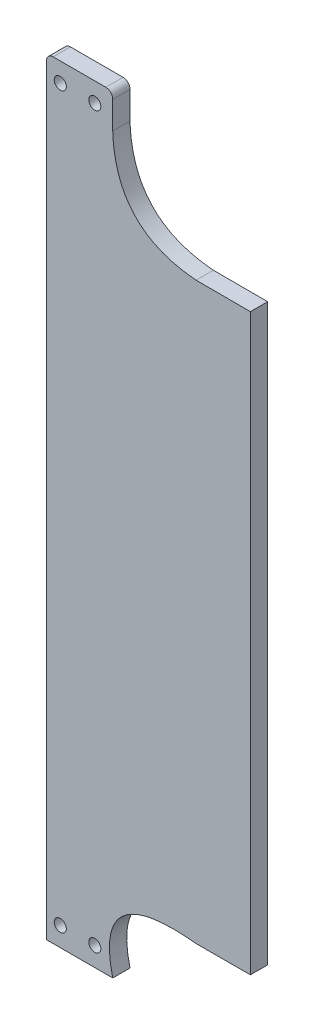
ISO-10303-21;
HEADER;
FILE_DESCRIPTION(('STEP AP214'),'2;1');
FILE_NAME('part.step','',(''),(''),'','','');
FILE_SCHEMA(('AUTOMOTIVE_DESIGN { 1 0 10303 214 1 1 1 1 }'));
ENDSEC;
DATA;
#1=APPLICATION_CONTEXT('core data for automotive mechanical design processes');
#2=APPLICATION_PROTOCOL_DEFINITION('international standard','automotive_design',2000,#1);
#3=PRODUCT_CONTEXT('',#1,'mechanical');
#4=PRODUCT('Part','Part','',(#3));
#5=PRODUCT_RELATED_PRODUCT_CATEGORY('part','',(#4));
#6=PRODUCT_DEFINITION_FORMATION('','',#4);
#7=PRODUCT_DEFINITION_CONTEXT('part definition',#1,'design');
#8=PRODUCT_DEFINITION('design','',#6,#7);
#9=PRODUCT_DEFINITION_SHAPE('','',#8);
#10=(LENGTH_UNIT() NAMED_UNIT(*) SI_UNIT(.MILLI.,.METRE.));
#11=(NAMED_UNIT(*) PLANE_ANGLE_UNIT() SI_UNIT($,.RADIAN.));
#12=(NAMED_UNIT(*) SI_UNIT($,.STERADIAN.) SOLID_ANGLE_UNIT());
#13=UNCERTAINTY_MEASURE_WITH_UNIT(LENGTH_MEASURE(1.E-05),#10,'distance_accuracy_value','');
#14=(GEOMETRIC_REPRESENTATION_CONTEXT(3) GLOBAL_UNCERTAINTY_ASSIGNED_CONTEXT((#13)) GLOBAL_UNIT_ASSIGNED_CONTEXT((#10,
#11,#12)) REPRESENTATION_CONTEXT('',''));
#15=CARTESIAN_POINT('',(0.,0.,0.));
#16=DIRECTION('',(0.,0.,1.));
#17=DIRECTION('',(1.,0.,0.));
#18=AXIS2_PLACEMENT_3D('',#15,#16,#17);
#19=CARTESIAN_POINT('',(1.92755112688842,-93.5000000001454,5.));
#20=DIRECTION('',(0.,0.,1.));
#21=DIRECTION('',(1.,0.,0.));
#22=AXIS2_PLACEMENT_3D('',#19,#20,#21);
#23=PLANE('',#22);
#24=CARTESIAN_POINT('',(-1.27515400107317,-308.406186344161,5.));
#25=DIRECTION('',(0.,0.,1.));
#26=DIRECTION('',(-1.,0.,0.));
#27=AXIS2_PLACEMENT_3D('',#24,#25,#26);
#28=CIRCLE('',#27,1.74999999999976);
#29=CARTESIAN_POINT('',(-3.02515400107293,-308.406186344161,5.));
#30=VERTEX_POINT('',#29);
#31=EDGE_CURVE('E266',#30,#30,#28,.T.);
#32=ORIENTED_EDGE('',*,*,#31,.F.);
#33=EDGE_LOOP('',(#32));
#34=FACE_BOUND('',#33,.T.);
#35=CARTESIAN_POINT('',(-11.2751540010733,-97.0938136561303,5.));
#36=DIRECTION('',(0.,0.,1.));
#37=DIRECTION('',(1.,0.,0.));
#38=AXIS2_PLACEMENT_3D('',#35,#36,#37);
#39=CIRCLE('',#38,1.75);
#40=CARTESIAN_POINT('',(-9.52515400107332,-97.0938136561303,5.));
#41=VERTEX_POINT('',#40);
#42=EDGE_CURVE('E251',#41,#41,#39,.T.);
#43=ORIENTED_EDGE('',*,*,#42,.F.);
#44=EDGE_LOOP('',(#43));
#45=FACE_BOUND('',#44,.T.);
#46=CARTESIAN_POINT('',(1.92755112688842,-93.5000000001454,5.));
#47=DIRECTION('',(0.,0.,1.));
#48=DIRECTION('',(1.,0.,0.));
#49=AXIS2_PLACEMENT_3D('',#46,#47,#48);
#50=CIRCLE('',#49,2.);
#51=CARTESIAN_POINT('',(3.92755005346529,-93.5020721225688,5.));
#52=VERTEX_POINT('',#51);
#53=CARTESIAN_POINT('',(1.9275511268884,-91.5000000001454,5.));
#54=VERTEX_POINT('',#53);
#55=EDGE_CURVE('E215',#52,#54,#50,.T.);
#56=ORIENTED_EDGE('',*,*,#55,.T.);
#57=DIRECTION('',(-1.,0.,0.));
#58=VECTOR('',#57,1.);
#59=CARTESIAN_POINT('',(1.9275511268884,-91.5000000001454,5.));
#60=LINE('',#59,#58);
#61=CARTESIAN_POINT('',(-13.3098392259202,-91.5000000001454,5.));
#62=VERTEX_POINT('',#61);
#63=EDGE_CURVE('E113',#54,#62,#60,.T.);
#64=ORIENTED_EDGE('',*,*,#63,.T.);
#65=CARTESIAN_POINT('',(-13.3098392259202,-93.5000000001454,5.));
#66=DIRECTION('',(0.,0.,1.));
#67=DIRECTION('',(1.,0.,0.));
#68=AXIS2_PLACEMENT_3D('',#65,#66,#67);
#69=CIRCLE('',#68,2.);
#70=CARTESIAN_POINT('',(-15.3098392259202,-93.5000000001454,5.));
#71=VERTEX_POINT('',#70);
#72=EDGE_CURVE('E211',#62,#71,#69,.T.);
#73=ORIENTED_EDGE('',*,*,#72,.T.);
#74=DIRECTION('',(0.,-1.,0.));
#75=VECTOR('',#74,1.);
#76=CARTESIAN_POINT('',(-15.3098392259202,-93.5000000001454,5.));
#77=LINE('',#76,#75);
#78=CARTESIAN_POINT('',(-15.3098392259202,-314.000000000146,5.));
#79=VERTEX_POINT('',#78);
#80=EDGE_CURVE('E209',#71,#79,#77,.T.);
#81=ORIENTED_EDGE('',*,*,#80,.T.);
#82=DIRECTION('',(1.,0.,0.));
#83=VECTOR('',#82,1.);
#84=CARTESIAN_POINT('',(-13.3098392259202,-314.000000000146,5.));
#85=LINE('',#84,#83);
#86=CARTESIAN_POINT('',(3.92755005346529,-314.000000000146,5.));
#87=VERTEX_POINT('',#86);
#88=EDGE_CURVE('E200',#79,#87,#85,.T.);
#89=ORIENTED_EDGE('',*,*,#88,.T.);
#90=CARTESIAN_POINT('',(3.92755005346529,-314.000000000146,5.));
#91=CARTESIAN_POINT('',(-1.94355043772238,-290.062596381269,5.));
#92=CARTESIAN_POINT('',(28.0655917494336,-293.30246070398,5.));
#93=B_SPLINE_CURVE_WITH_KNOTS('',2,(#90,#91,#92),.UNSPECIFIED.,.F.,.F.,(3,3),(0.,1.),.UNSPECIFIED.);
#94=CARTESIAN_POINT('',(28.0655917494336,-293.30246070398,5.));
#95=VERTEX_POINT('',#94);
#96=EDGE_CURVE('E192',#87,#95,#93,.T.);
#97=ORIENTED_EDGE('',*,*,#96,.T.);
#98=DIRECTION('',(0.999997102980097,0.00240707943636174,0.));
#99=VECTOR('',#98,1.);
#100=CARTESIAN_POINT('',(28.0655917494336,-293.30246070398,5.));
#101=LINE('',#100,#99);
#102=CARTESIAN_POINT('',(43.8097574960034,-293.264563136579,5.));
#103=VERTEX_POINT('',#102);
#104=EDGE_CURVE('E199',#95,#103,#101,.T.);
#105=ORIENTED_EDGE('',*,*,#104,.T.);
#106=DIRECTION('',(0.,1.,0.));
#107=VECTOR('',#106,1.);
#108=CARTESIAN_POINT('',(43.8097574960034,-126.863648017031,5.));
#109=LINE('',#108,#107);
#110=CARTESIAN_POINT('',(43.8097574960034,-126.863648017031,5.));
#111=VERTEX_POINT('',#110);
#112=EDGE_CURVE('E141',#103,#111,#109,.T.);
#113=ORIENTED_EDGE('',*,*,#112,.T.);
#114=DIRECTION('',(-0.999997102980097,0.00240707943635998,0.));
#115=VECTOR('',#114,1.);
#116=CARTESIAN_POINT('',(28.0655917494336,-126.82575044963,5.));
#117=LINE('',#116,#115);
#118=CARTESIAN_POINT('',(28.0655917494336,-126.82575044963,5.));
#119=VERTEX_POINT('',#118);
#120=EDGE_CURVE('E135',#111,#119,#117,.T.);
#121=ORIENTED_EDGE('',*,*,#120,.T.);
#122=CARTESIAN_POINT('',(28.0655917494336,-126.82575044963,5.));
#123=CARTESIAN_POINT('',(4.76202982429411,-124.978966699409,5.));
#124=CARTESIAN_POINT('',(3.91926370617012,-101.500000000145,5.));
#125=B_SPLINE_CURVE_WITH_KNOTS('',2,(#122,#123,#124),.UNSPECIFIED.,.F.,.F.,(3,3),(0.,1.),.UNSPECIFIED.);
#126=CARTESIAN_POINT('',(3.91926370617012,-101.500000000145,5.));
#127=VERTEX_POINT('',#126);
#128=EDGE_CURVE('E139',#119,#127,#125,.T.);
#129=ORIENTED_EDGE('',*,*,#128,.T.);
#130=DIRECTION('',(0.00103606121168273,0.999999463288439,0.));
#131=VECTOR('',#130,1.);
#132=CARTESIAN_POINT('',(3.91926370617012,-101.500000000145,5.));
#133=LINE('',#132,#131);
#134=EDGE_CURVE('E61',#127,#52,#133,.T.);
#135=ORIENTED_EDGE('',*,*,#134,.T.);
#136=EDGE_LOOP('',(#56,#64,#73,#81,#89,#97,#105,#113,#121,#129,#135));
#137=FACE_BOUND('',#136,.T.);
#138=CARTESIAN_POINT('',(-1.27515400107332,-97.0938136561303,5.));
#139=DIRECTION('',(0.,0.,1.));
#140=DIRECTION('',(1.,0.,0.));
#141=AXIS2_PLACEMENT_3D('',#138,#139,#140);
#142=CIRCLE('',#141,1.75);
#143=CARTESIAN_POINT('',(0.474845998926684,-97.0938136561303,5.));
#144=VERTEX_POINT('',#143);
#145=EDGE_CURVE('E258',#144,#144,#142,.T.);
#146=ORIENTED_EDGE('',*,*,#145,.F.);
#147=EDGE_LOOP('',(#146));
#148=FACE_BOUND('',#147,.T.);
#149=CARTESIAN_POINT('',(-11.2751540010732,-308.406186344161,5.));
#150=DIRECTION('',(0.,0.,1.));
#151=DIRECTION('',(-1.,0.,0.));
#152=AXIS2_PLACEMENT_3D('',#149,#150,#151);
#153=CIRCLE('',#152,1.74999999999985);
#154=CARTESIAN_POINT('',(-13.025154001073,-308.406186344161,5.));
#155=VERTEX_POINT('',#154);
#156=EDGE_CURVE('E274',#155,#155,#153,.T.);
#157=ORIENTED_EDGE('',*,*,#156,.F.);
#158=EDGE_LOOP('',(#157));
#159=FACE_BOUND('',#158,.T.);
#160=ADVANCED_FACE('F43',(#34,#45,#137,#148,#159),#23,.T.);
#161=CARTESIAN_POINT('',(1.92755112688842,-93.5000000001454,0.));
#162=DIRECTION('',(0.,0.,1.));
#163=DIRECTION('',(1.,0.,0.));
#164=AXIS2_PLACEMENT_3D('',#161,#162,#163);
#165=PLANE('',#164);
#166=CARTESIAN_POINT('',(1.92755112688842,-93.5000000001454,0.));
#167=DIRECTION('',(0.,0.,1.));
#168=DIRECTION('',(1.,0.,0.));
#169=AXIS2_PLACEMENT_3D('',#166,#167,#168);
#170=CIRCLE('',#169,2.);
#171=CARTESIAN_POINT('',(3.92755005346529,-93.5020721225688,0.));
#172=VERTEX_POINT('',#171);
#173=CARTESIAN_POINT('',(1.9275511268884,-91.5000000001454,0.));
#174=VERTEX_POINT('',#173);
#175=EDGE_CURVE('E247',#172,#174,#170,.T.);
#176=ORIENTED_EDGE('',*,*,#175,.F.);
#177=DIRECTION('',(0.00103606121168273,0.999999463288439,0.));
#178=VECTOR('',#177,1.);
#179=CARTESIAN_POINT('',(3.91926370617012,-101.500000000145,0.));
#180=LINE('',#179,#178);
#181=CARTESIAN_POINT('',(3.91926370617012,-101.500000000145,0.));
#182=VERTEX_POINT('',#181);
#183=EDGE_CURVE('E105',#182,#172,#180,.T.);
#184=ORIENTED_EDGE('',*,*,#183,.F.);
#185=CARTESIAN_POINT('',(28.0655917494336,-126.82575044963,0.));
#186=CARTESIAN_POINT('',(4.76202982429411,-124.978966699409,0.));
#187=CARTESIAN_POINT('',(3.91926370617012,-101.500000000145,0.));
#188=B_SPLINE_CURVE_WITH_KNOTS('',2,(#185,#186,#187),.UNSPECIFIED.,.F.,.F.,(3,3),(0.,1.),.UNSPECIFIED.);
#189=CARTESIAN_POINT('',(28.0655917494336,-126.82575044963,0.));
#190=VERTEX_POINT('',#189);
#191=EDGE_CURVE('E99',#190,#182,#188,.T.);
#192=ORIENTED_EDGE('',*,*,#191,.F.);
#193=DIRECTION('',(-0.999997102980097,0.00240707943635998,0.));
#194=VECTOR('',#193,1.);
#195=CARTESIAN_POINT('',(28.0655917494336,-126.82575044963,0.));
#196=LINE('',#195,#194);
#197=CARTESIAN_POINT('',(43.8097574960034,-126.863648017031,0.));
#198=VERTEX_POINT('',#197);
#199=EDGE_CURVE('E150',#198,#190,#196,.T.);
#200=ORIENTED_EDGE('',*,*,#199,.F.);
#201=DIRECTION('',(0.,1.,0.));
#202=VECTOR('',#201,1.);
#203=CARTESIAN_POINT('',(43.8097574960034,-126.863648017031,0.));
#204=LINE('',#203,#202);
#205=CARTESIAN_POINT('',(43.8097574960034,-293.264563136579,0.));
#206=VERTEX_POINT('',#205);
#207=EDGE_CURVE('E224',#206,#198,#204,.T.);
#208=ORIENTED_EDGE('',*,*,#207,.F.);
#209=DIRECTION('',(0.999997102980097,0.00240707943636174,0.));
#210=VECTOR('',#209,1.);
#211=CARTESIAN_POINT('',(28.0655917494336,-293.30246070398,0.));
#212=LINE('',#211,#210);
#213=CARTESIAN_POINT('',(28.0655917494336,-293.30246070398,0.));
#214=VERTEX_POINT('',#213);
#215=EDGE_CURVE('E227',#214,#206,#212,.T.);
#216=ORIENTED_EDGE('',*,*,#215,.F.);
#217=CARTESIAN_POINT('',(3.92755005346529,-314.000000000146,0.));
#218=CARTESIAN_POINT('',(-1.94355043772238,-290.062596381269,0.));
#219=CARTESIAN_POINT('',(28.0655917494336,-293.30246070398,0.));
#220=B_SPLINE_CURVE_WITH_KNOTS('',2,(#217,#218,#219),.UNSPECIFIED.,.F.,.F.,(3,3),(0.,1.),.UNSPECIFIED.);
#221=CARTESIAN_POINT('',(3.92755005346529,-314.000000000146,0.));
#222=VERTEX_POINT('',#221);
#223=EDGE_CURVE('E230',#222,#214,#220,.T.);
#224=ORIENTED_EDGE('',*,*,#223,.F.);
#225=DIRECTION('',(1.,0.,0.));
#226=VECTOR('',#225,1.);
#227=CARTESIAN_POINT('',(3.92755005346529,-314.000000000146,0.));
#228=LINE('',#227,#226);
#229=CARTESIAN_POINT('',(-15.3098392259202,-314.000000000146,0.));
#230=VERTEX_POINT('',#229);
#231=EDGE_CURVE('E233',#230,#222,#228,.T.);
#232=ORIENTED_EDGE('',*,*,#231,.F.);
#233=DIRECTION('',(0.,-1.,0.));
#234=VECTOR('',#233,1.);
#235=CARTESIAN_POINT('',(-15.3098392259202,-106.128211153464,0.));
#236=LINE('',#235,#234);
#237=CARTESIAN_POINT('',(-15.3098392259202,-93.5000000001454,0.));
#238=VERTEX_POINT('',#237);
#239=EDGE_CURVE('E236',#238,#230,#236,.T.);
#240=ORIENTED_EDGE('',*,*,#239,.F.);
#241=CARTESIAN_POINT('',(-13.3098392259202,-93.5000000001454,0.));
#242=DIRECTION('',(0.,0.,1.));
#243=DIRECTION('',(1.,0.,0.));
#244=AXIS2_PLACEMENT_3D('',#241,#242,#243);
#245=CIRCLE('',#244,2.);
#246=CARTESIAN_POINT('',(-13.3098392259202,-91.5000000001454,0.));
#247=VERTEX_POINT('',#246);
#248=EDGE_CURVE('E240',#247,#238,#245,.T.);
#249=ORIENTED_EDGE('',*,*,#248,.F.);
#250=DIRECTION('',(-1.,0.,0.));
#251=VECTOR('',#250,1.);
#252=CARTESIAN_POINT('',(1.9275511268884,-91.5000000001454,0.));
#253=LINE('',#252,#251);
#254=EDGE_CURVE('E244',#174,#247,#253,.T.);
#255=ORIENTED_EDGE('',*,*,#254,.F.);
#256=EDGE_LOOP('',(#176,#184,#192,#200,#208,#216,#224,#232,#240,#249,#255));
#257=FACE_BOUND('',#256,.T.);
#258=CARTESIAN_POINT('',(-11.2751540010733,-97.0938136561303,0.));
#259=DIRECTION('',(0.,0.,1.));
#260=DIRECTION('',(1.,0.,0.));
#261=AXIS2_PLACEMENT_3D('',#258,#259,#260);
#262=CIRCLE('',#261,1.75);
#263=CARTESIAN_POINT('',(-9.52515400107332,-97.0938136561303,0.));
#264=VERTEX_POINT('',#263);
#265=EDGE_CURVE('E254',#264,#264,#262,.T.);
#266=ORIENTED_EDGE('',*,*,#265,.T.);
#267=EDGE_LOOP('',(#266));
#268=FACE_BOUND('',#267,.T.);
#269=CARTESIAN_POINT('',(-1.27515400107332,-97.0938136561303,0.));
#270=DIRECTION('',(0.,0.,1.));
#271=DIRECTION('',(1.,0.,0.));
#272=AXIS2_PLACEMENT_3D('',#269,#270,#271);
#273=CIRCLE('',#272,1.75);
#274=CARTESIAN_POINT('',(0.474845998926684,-97.0938136561303,0.));
#275=VERTEX_POINT('',#274);
#276=EDGE_CURVE('E262',#275,#275,#273,.T.);
#277=ORIENTED_EDGE('',*,*,#276,.T.);
#278=EDGE_LOOP('',(#277));
#279=FACE_BOUND('',#278,.T.);
#280=CARTESIAN_POINT('',(-1.27515400107317,-308.406186344161,0.));
#281=DIRECTION('',(0.,0.,1.));
#282=DIRECTION('',(-1.,0.,0.));
#283=AXIS2_PLACEMENT_3D('',#280,#281,#282);
#284=CIRCLE('',#283,1.74999999999976);
#285=CARTESIAN_POINT('',(-3.02515400107293,-308.406186344161,0.));
#286=VERTEX_POINT('',#285);
#287=EDGE_CURVE('E270',#286,#286,#284,.T.);
#288=ORIENTED_EDGE('',*,*,#287,.T.);
#289=EDGE_LOOP('',(#288));
#290=FACE_BOUND('',#289,.T.);
#291=CARTESIAN_POINT('',(-11.2751540010732,-308.406186344161,0.));
#292=DIRECTION('',(0.,0.,1.));
#293=DIRECTION('',(-1.,0.,0.));
#294=AXIS2_PLACEMENT_3D('',#291,#292,#293);
#295=CIRCLE('',#294,1.74999999999985);
#296=CARTESIAN_POINT('',(-13.025154001073,-308.406186344161,0.));
#297=VERTEX_POINT('',#296);
#298=EDGE_CURVE('E278',#297,#297,#295,.T.);
#299=ORIENTED_EDGE('',*,*,#298,.T.);
#300=EDGE_LOOP('',(#299));
#301=FACE_BOUND('',#300,.T.);
#302=ADVANCED_FACE('F284',(#257,#268,#279,#290,#301),#165,.F.);
#303=CARTESIAN_POINT('',(1.92755112688842,-93.5000000001454,5.));
#304=DIRECTION('',(0.,0.,-1.));
#305=DIRECTION('',(-1.,0.,0.));
#306=AXIS2_PLACEMENT_3D('',#303,#304,#305);
#307=CYLINDRICAL_SURFACE('',#306,2.);
#308=ORIENTED_EDGE('',*,*,#175,.T.);
#309=DIRECTION('',(0.,0.,-1.));
#310=VECTOR('',#309,1.);
#311=CARTESIAN_POINT('',(1.9275511268884,-91.5000000001454,5.));
#312=LINE('',#311,#310);
#313=EDGE_CURVE('E11',#54,#174,#312,.T.);
#314=ORIENTED_EDGE('',*,*,#313,.F.);
#315=ORIENTED_EDGE('',*,*,#55,.F.);
#316=DIRECTION('',(0.,0.,-1.));
#317=VECTOR('',#316,1.);
#318=CARTESIAN_POINT('',(3.92755005346529,-93.5020721225688,5.));
#319=LINE('',#318,#317);
#320=EDGE_CURVE('E159',#52,#172,#319,.T.);
#321=ORIENTED_EDGE('',*,*,#320,.T.);
#322=EDGE_LOOP('',(#308,#314,#315,#321));
#323=FACE_BOUND('',#322,.T.);
#324=ADVANCED_FACE('F45',(#323),#307,.T.);
#325=CARTESIAN_POINT('',(1.9275511268884,-91.5000000001454,5.));
#326=DIRECTION('',(0.,-1.,0.));
#327=DIRECTION('',(0.,0.,-1.));
#328=AXIS2_PLACEMENT_3D('',#325,#326,#327);
#329=PLANE('',#328);
#330=ORIENTED_EDGE('',*,*,#254,.T.);
#331=DIRECTION('',(0.,0.,-1.));
#332=VECTOR('',#331,1.);
#333=CARTESIAN_POINT('',(-13.3098392259202,-91.5000000001454,5.));
#334=LINE('',#333,#332);
#335=EDGE_CURVE('E53',#62,#247,#334,.T.);
#336=ORIENTED_EDGE('',*,*,#335,.F.);
#337=ORIENTED_EDGE('',*,*,#63,.F.);
#338=ORIENTED_EDGE('',*,*,#313,.T.);
#339=EDGE_LOOP('',(#330,#336,#337,#338));
#340=FACE_BOUND('',#339,.T.);
#341=ADVANCED_FACE('F412',(#340),#329,.F.);
#342=CARTESIAN_POINT('',(-13.3098392259202,-93.5000000001454,5.));
#343=DIRECTION('',(0.,0.,-1.));
#344=DIRECTION('',(-1.,0.,0.));
#345=AXIS2_PLACEMENT_3D('',#342,#343,#344);
#346=CYLINDRICAL_SURFACE('',#345,2.);
#347=ORIENTED_EDGE('',*,*,#248,.T.);
#348=DIRECTION('',(0.,0.,-1.));
#349=VECTOR('',#348,1.);
#350=CARTESIAN_POINT('',(-15.3098392259202,-93.5000000001454,5.));
#351=LINE('',#350,#349);
#352=EDGE_CURVE('E487',#71,#238,#351,.T.);
#353=ORIENTED_EDGE('',*,*,#352,.F.);
#354=ORIENTED_EDGE('',*,*,#72,.F.);
#355=ORIENTED_EDGE('',*,*,#335,.T.);
#356=EDGE_LOOP('',(#347,#353,#354,#355));
#357=FACE_BOUND('',#356,.T.);
#358=ADVANCED_FACE('F404',(#357),#346,.T.);
#359=CARTESIAN_POINT('',(-15.3098392259202,-106.128211153464,5.));
#360=DIRECTION('',(1.,0.,0.));
#361=DIRECTION('',(0.,0.,-1.));
#362=AXIS2_PLACEMENT_3D('',#359,#360,#361);
#363=PLANE('',#362);
#364=ORIENTED_EDGE('',*,*,#239,.T.);
#365=DIRECTION('',(0.,0.,-1.));
#366=VECTOR('',#365,1.);
#367=CARTESIAN_POINT('',(-15.3098392259202,-314.000000000146,5.));
#368=LINE('',#367,#366);
#369=EDGE_CURVE('E489',#79,#230,#368,.T.);
#370=ORIENTED_EDGE('',*,*,#369,.F.);
#371=ORIENTED_EDGE('',*,*,#80,.F.);
#372=ORIENTED_EDGE('',*,*,#352,.T.);
#373=EDGE_LOOP('',(#364,#370,#371,#372));
#374=FACE_BOUND('',#373,.T.);
#375=ADVANCED_FACE('F394',(#374),#363,.F.);
#376=CARTESIAN_POINT('',(3.92755005346529,-314.000000000146,5.));
#377=DIRECTION('',(0.,1.,0.));
#378=DIRECTION('',(0.,0.,1.));
#379=AXIS2_PLACEMENT_3D('',#376,#377,#378);
#380=PLANE('',#379);
#381=ORIENTED_EDGE('',*,*,#231,.T.);
#382=DIRECTION('',(0.,0.,-1.));
#383=VECTOR('',#382,1.);
#384=CARTESIAN_POINT('',(3.92755005346529,-314.000000000146,5.));
#385=LINE('',#384,#383);
#386=EDGE_CURVE('E495',#87,#222,#385,.T.);
#387=ORIENTED_EDGE('',*,*,#386,.F.);
#388=ORIENTED_EDGE('',*,*,#88,.F.);
#389=ORIENTED_EDGE('',*,*,#369,.T.);
#390=EDGE_LOOP('',(#381,#387,#388,#389));
#391=FACE_BOUND('',#390,.T.);
#392=ADVANCED_FACE('F189',(#391),#380,.F.);
#393=DIRECTION('',(0.,0.,-1.));
#394=VECTOR('',#393,1.);
#395=SURFACE_OF_LINEAR_EXTRUSION('',#93,#394);
#396=ORIENTED_EDGE('',*,*,#223,.T.);
#397=DIRECTION('',(0.,0.,-1.));
#398=VECTOR('',#397,1.);
#399=CARTESIAN_POINT('',(28.0655917494336,-293.30246070398,5.));
#400=LINE('',#399,#398);
#401=EDGE_CURVE('E499',#95,#214,#400,.T.);
#402=ORIENTED_EDGE('',*,*,#401,.F.);
#403=ORIENTED_EDGE('',*,*,#96,.F.);
#404=ORIENTED_EDGE('',*,*,#386,.T.);
#405=EDGE_LOOP('',(#396,#402,#403,#404));
#406=FACE_BOUND('',#405,.T.);
#407=ADVANCED_FACE('F184',(#406),#395,.F.);
#408=CARTESIAN_POINT('',(28.0655917494336,-293.30246070398,5.));
#409=DIRECTION('',(-0.00240707943636174,0.999997102980097,0.));
#410=DIRECTION('',(-0.999997102980097,-0.00240707943636174,0.));
#411=AXIS2_PLACEMENT_3D('',#408,#409,#410);
#412=PLANE('',#411);
#413=ORIENTED_EDGE('',*,*,#215,.T.);
#414=DIRECTION('',(0.,0.,-1.));
#415=VECTOR('',#414,1.);
#416=CARTESIAN_POINT('',(43.8097574960034,-293.264563136579,5.));
#417=LINE('',#416,#415);
#418=EDGE_CURVE('E503',#103,#206,#417,.T.);
#419=ORIENTED_EDGE('',*,*,#418,.F.);
#420=ORIENTED_EDGE('',*,*,#104,.F.);
#421=ORIENTED_EDGE('',*,*,#401,.T.);
#422=EDGE_LOOP('',(#413,#419,#420,#421));
#423=FACE_BOUND('',#422,.T.);
#424=ADVANCED_FACE('F180',(#423),#412,.F.);
#425=CARTESIAN_POINT('',(43.8097574960034,-126.863648017031,5.));
#426=DIRECTION('',(-1.,0.,0.));
#427=DIRECTION('',(0.,0.,1.));
#428=AXIS2_PLACEMENT_3D('',#425,#426,#427);
#429=PLANE('',#428);
#430=ORIENTED_EDGE('',*,*,#207,.T.);
#431=DIRECTION('',(0.,0.,-1.));
#432=VECTOR('',#431,1.);
#433=CARTESIAN_POINT('',(43.8097574960034,-126.863648017031,5.));
#434=LINE('',#433,#432);
#435=EDGE_CURVE('E152',#111,#198,#434,.T.);
#436=ORIENTED_EDGE('',*,*,#435,.F.);
#437=ORIENTED_EDGE('',*,*,#112,.F.);
#438=ORIENTED_EDGE('',*,*,#418,.T.);
#439=EDGE_LOOP('',(#430,#436,#437,#438));
#440=FACE_BOUND('',#439,.T.);
#441=ADVANCED_FACE('F177',(#440),#429,.F.);
#442=CARTESIAN_POINT('',(28.0655917494336,-126.82575044963,5.));
#443=DIRECTION('',(-0.00240707943635998,-0.999997102980097,0.));
#444=DIRECTION('',(0.999997102980097,-0.00240707943635998,0.));
#445=AXIS2_PLACEMENT_3D('',#442,#443,#444);
#446=PLANE('',#445);
#447=ORIENTED_EDGE('',*,*,#199,.T.);
#448=DIRECTION('',(0.,0.,-1.));
#449=VECTOR('',#448,1.);
#450=CARTESIAN_POINT('',(28.0655917494336,-126.82575044963,5.));
#451=LINE('',#450,#449);
#452=EDGE_CURVE('E147',#119,#190,#451,.T.);
#453=ORIENTED_EDGE('',*,*,#452,.F.);
#454=ORIENTED_EDGE('',*,*,#120,.F.);
#455=ORIENTED_EDGE('',*,*,#435,.T.);
#456=EDGE_LOOP('',(#447,#453,#454,#455));
#457=FACE_BOUND('',#456,.T.);
#458=ADVANCED_FACE('F148',(#457),#446,.F.);
#459=DIRECTION('',(0.,0.,-1.));
#460=VECTOR('',#459,1.);
#461=SURFACE_OF_LINEAR_EXTRUSION('',#125,#460);
#462=ORIENTED_EDGE('',*,*,#191,.T.);
#463=DIRECTION('',(0.,0.,-1.));
#464=VECTOR('',#463,1.);
#465=CARTESIAN_POINT('',(3.91926370617012,-101.500000000145,5.));
#466=LINE('',#465,#464);
#467=EDGE_CURVE('E153',#127,#182,#466,.T.);
#468=ORIENTED_EDGE('',*,*,#467,.F.);
#469=ORIENTED_EDGE('',*,*,#128,.F.);
#470=ORIENTED_EDGE('',*,*,#452,.T.);
#471=EDGE_LOOP('',(#462,#468,#469,#470));
#472=FACE_BOUND('',#471,.T.);
#473=ADVANCED_FACE('F155',(#472),#461,.F.);
#474=CARTESIAN_POINT('',(3.91926370617012,-101.500000000145,5.));
#475=DIRECTION('',(-0.999999463288439,0.00103606121168273,0.));
#476=DIRECTION('',(-0.00103606121168273,-0.999999463288439,0.));
#477=AXIS2_PLACEMENT_3D('',#474,#475,#476);
#478=PLANE('',#477);
#479=ORIENTED_EDGE('',*,*,#183,.T.);
#480=ORIENTED_EDGE('',*,*,#320,.F.);
#481=ORIENTED_EDGE('',*,*,#134,.F.);
#482=ORIENTED_EDGE('',*,*,#467,.T.);
#483=EDGE_LOOP('',(#479,#480,#481,#482));
#484=FACE_BOUND('',#483,.T.);
#485=ADVANCED_FACE('F173',(#484),#478,.F.);
#486=CARTESIAN_POINT('',(-11.2751540010733,-97.0938136561303,5.));
#487=DIRECTION('',(0.,0.,-1.));
#488=DIRECTION('',(-1.,0.,0.));
#489=AXIS2_PLACEMENT_3D('',#486,#487,#488);
#490=CYLINDRICAL_SURFACE('',#489,1.75);
#491=ORIENTED_EDGE('',*,*,#42,.T.);
#492=EDGE_LOOP('',(#491));
#493=FACE_BOUND('',#492,.T.);
#494=ORIENTED_EDGE('',*,*,#265,.F.);
#495=EDGE_LOOP('',(#494));
#496=FACE_BOUND('',#495,.T.);
#497=ADVANCED_FACE('F307',(#493,#496),#490,.F.);
#498=CARTESIAN_POINT('',(-1.27515400107332,-97.0938136561303,5.));
#499=DIRECTION('',(0.,0.,-1.));
#500=DIRECTION('',(-1.,0.,0.));
#501=AXIS2_PLACEMENT_3D('',#498,#499,#500);
#502=CYLINDRICAL_SURFACE('',#501,1.75);
#503=ORIENTED_EDGE('',*,*,#145,.T.);
#504=EDGE_LOOP('',(#503));
#505=FACE_BOUND('',#504,.T.);
#506=ORIENTED_EDGE('',*,*,#276,.F.);
#507=EDGE_LOOP('',(#506));
#508=FACE_BOUND('',#507,.T.);
#509=ADVANCED_FACE('F294',(#505,#508),#502,.F.);
#510=CARTESIAN_POINT('',(-1.27515400107317,-308.406186344161,5.));
#511=DIRECTION('',(0.,0.,-1.));
#512=DIRECTION('',(-1.,0.,0.));
#513=AXIS2_PLACEMENT_3D('',#510,#511,#512);
#514=CYLINDRICAL_SURFACE('',#513,1.74999999999976);
#515=ORIENTED_EDGE('',*,*,#31,.T.);
#516=EDGE_LOOP('',(#515));
#517=FACE_BOUND('',#516,.T.);
#518=ORIENTED_EDGE('',*,*,#287,.F.);
#519=EDGE_LOOP('',(#518));
#520=FACE_BOUND('',#519,.T.);
#521=ADVANCED_FACE('F288',(#517,#520),#514,.F.);
#522=CARTESIAN_POINT('',(-11.2751540010732,-308.406186344161,5.));
#523=DIRECTION('',(0.,0.,-1.));
#524=DIRECTION('',(-1.,0.,0.));
#525=AXIS2_PLACEMENT_3D('',#522,#523,#524);
#526=CYLINDRICAL_SURFACE('',#525,1.74999999999985);
#527=ORIENTED_EDGE('',*,*,#156,.T.);
#528=EDGE_LOOP('',(#527));
#529=FACE_BOUND('',#528,.T.);
#530=ORIENTED_EDGE('',*,*,#298,.F.);
#531=EDGE_LOOP('',(#530));
#532=FACE_BOUND('',#531,.T.);
#533=ADVANCED_FACE('F286',(#529,#532),#526,.F.);
#534=CLOSED_SHELL('',(#160,#302,#324,#341,#358,#375,#392,#407,#424,#441,#458,#473,#485,#497,
#509,#521,#533));
#535=MANIFOLD_SOLID_BREP('B2',#534);
#536=ADVANCED_BREP_SHAPE_REPRESENTATION('',(#18,#535),#14);
#537=SHAPE_DEFINITION_REPRESENTATION(#9,#536);
ENDSEC;
END-ISO-10303-21;
